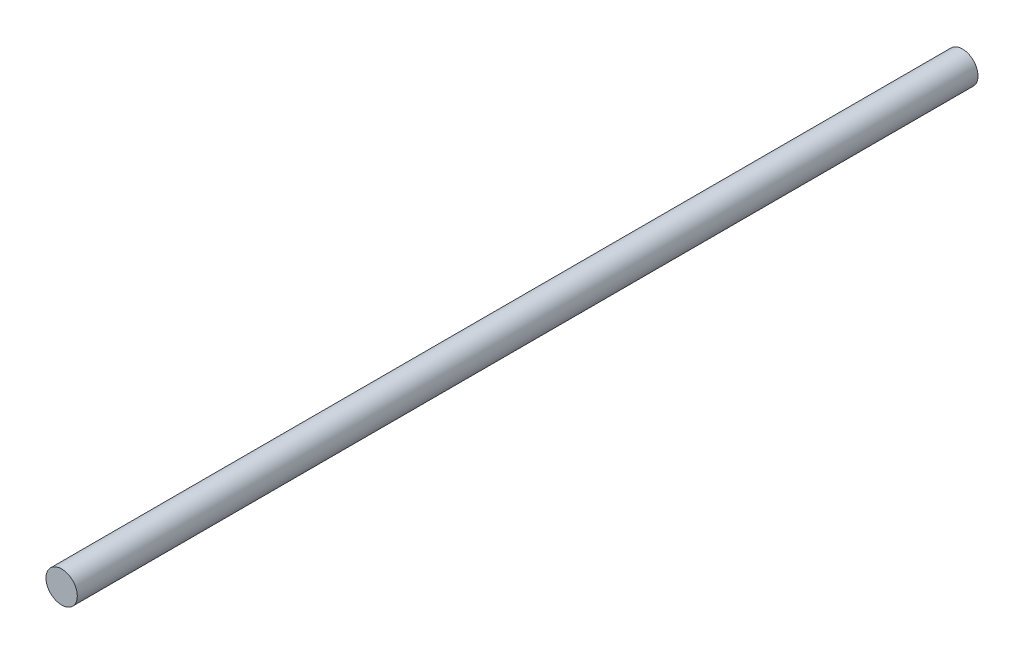
ISO-10303-21;
HEADER;
FILE_DESCRIPTION(('STEP AP214'),'2;1');
FILE_NAME('part.step','',(''),(''),'','','');
FILE_SCHEMA(('AUTOMOTIVE_DESIGN { 1 0 10303 214 1 1 1 1 }'));
ENDSEC;
DATA;
#1=APPLICATION_CONTEXT('core data for automotive mechanical design processes');
#2=APPLICATION_PROTOCOL_DEFINITION('international standard','automotive_design',2000,#1);
#3=PRODUCT_CONTEXT('',#1,'mechanical');
#4=PRODUCT('Part','Part','',(#3));
#5=PRODUCT_RELATED_PRODUCT_CATEGORY('part','',(#4));
#6=PRODUCT_DEFINITION_FORMATION('','',#4);
#7=PRODUCT_DEFINITION_CONTEXT('part definition',#1,'design');
#8=PRODUCT_DEFINITION('design','',#6,#7);
#9=PRODUCT_DEFINITION_SHAPE('','',#8);
#10=(LENGTH_UNIT() NAMED_UNIT(*) SI_UNIT(.MILLI.,.METRE.));
#11=(NAMED_UNIT(*) PLANE_ANGLE_UNIT() SI_UNIT($,.RADIAN.));
#12=(NAMED_UNIT(*) SI_UNIT($,.STERADIAN.) SOLID_ANGLE_UNIT());
#13=UNCERTAINTY_MEASURE_WITH_UNIT(LENGTH_MEASURE(1.E-05),#10,'distance_accuracy_value','');
#14=(GEOMETRIC_REPRESENTATION_CONTEXT(3) GLOBAL_UNCERTAINTY_ASSIGNED_CONTEXT((#13)) GLOBAL_UNIT_ASSIGNED_CONTEXT((#10,
#11,#12)) REPRESENTATION_CONTEXT('',''));
#15=CARTESIAN_POINT('',(0.,0.,0.));
#16=DIRECTION('',(0.,0.,1.));
#17=DIRECTION('',(1.,0.,0.));
#18=AXIS2_PLACEMENT_3D('',#15,#16,#17);
#19=CARTESIAN_POINT('',(0.,0.,115.));
#20=DIRECTION('',(0.,0.,-1.));
#21=DIRECTION('',(-1.,0.,0.));
#22=AXIS2_PLACEMENT_3D('',#19,#20,#21);
#23=CYLINDRICAL_SURFACE('',#22,2.);
#24=CARTESIAN_POINT('',(0.,0.,115.));
#25=DIRECTION('',(0.,0.,1.));
#26=DIRECTION('',(1.,0.,0.));
#27=AXIS2_PLACEMENT_3D('',#24,#25,#26);
#28=CIRCLE('',#27,2.);
#29=CARTESIAN_POINT('',(2.,0.,115.));
#30=VERTEX_POINT('',#29);
#31=EDGE_CURVE('E10',#30,#30,#28,.T.);
#32=ORIENTED_EDGE('',*,*,#31,.F.);
#33=EDGE_LOOP('',(#32));
#34=FACE_BOUND('',#33,.T.);
#35=CARTESIAN_POINT('',(0.,0.,0.));
#36=DIRECTION('',(0.,0.,1.));
#37=DIRECTION('',(1.,0.,0.));
#38=AXIS2_PLACEMENT_3D('',#35,#36,#37);
#39=CIRCLE('',#38,2.);
#40=CARTESIAN_POINT('',(2.,0.,0.));
#41=VERTEX_POINT('',#40);
#42=EDGE_CURVE('E36',#41,#41,#39,.T.);
#43=ORIENTED_EDGE('',*,*,#42,.T.);
#44=EDGE_LOOP('',(#43));
#45=FACE_BOUND('',#44,.T.);
#46=ADVANCED_FACE('F33',(#34,#45),#23,.T.);
#47=CARTESIAN_POINT('',(0.,0.,115.));
#48=DIRECTION('',(0.,0.,1.));
#49=DIRECTION('',(1.,0.,0.));
#50=AXIS2_PLACEMENT_3D('',#47,#48,#49);
#51=PLANE('',#50);
#52=ORIENTED_EDGE('',*,*,#31,.T.);
#53=EDGE_LOOP('',(#52));
#54=FACE_BOUND('',#53,.T.);
#55=ADVANCED_FACE('F48',(#54),#51,.T.);
#56=CARTESIAN_POINT('',(0.,0.,0.));
#57=DIRECTION('',(0.,0.,1.));
#58=DIRECTION('',(1.,0.,0.));
#59=AXIS2_PLACEMENT_3D('',#56,#57,#58);
#60=PLANE('',#59);
#61=ORIENTED_EDGE('',*,*,#42,.F.);
#62=EDGE_LOOP('',(#61));
#63=FACE_BOUND('',#62,.T.);
#64=ADVANCED_FACE('F46',(#63),#60,.F.);
#65=CLOSED_SHELL('',(#46,#55,#64));
#66=MANIFOLD_SOLID_BREP('B2',#65);
#67=ADVANCED_BREP_SHAPE_REPRESENTATION('',(#18,#66),#14);
#68=SHAPE_DEFINITION_REPRESENTATION(#9,#67);
ENDSEC;
END-ISO-10303-21;
